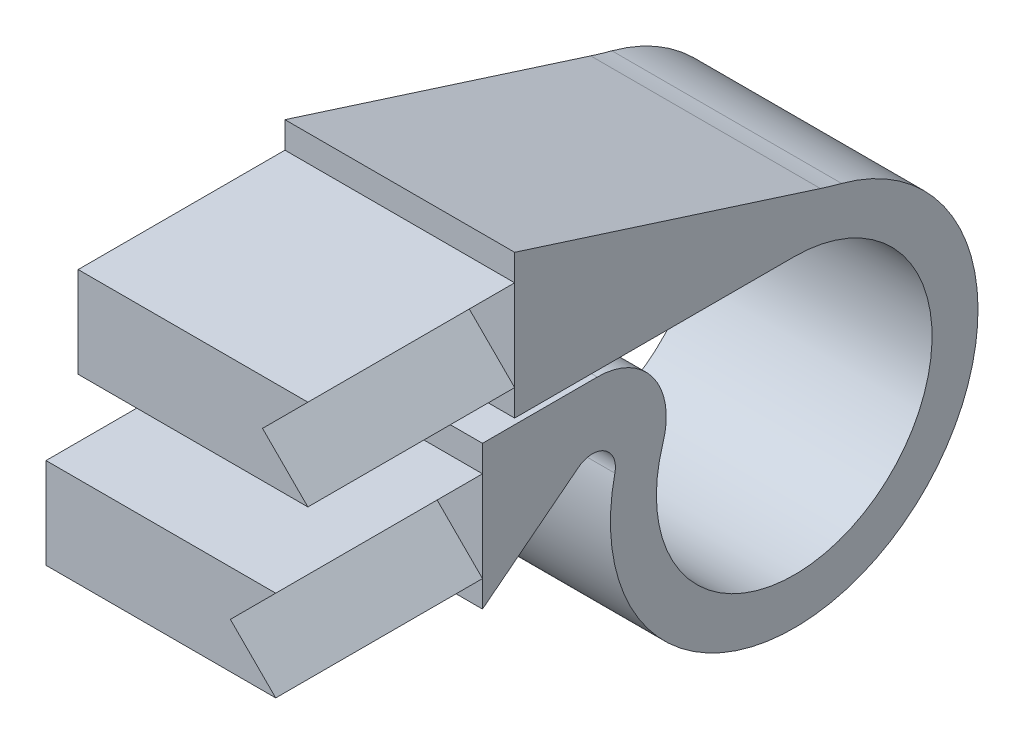
ISO-10303-21;
HEADER;
FILE_DESCRIPTION(('STEP AP214'),'2;1');
FILE_NAME('part.step','',(''),(''),'','','');
FILE_SCHEMA(('AUTOMOTIVE_DESIGN { 1 0 10303 214 1 1 1 1 }'));
ENDSEC;
DATA;
#1=APPLICATION_CONTEXT('core data for automotive mechanical design processes');
#2=APPLICATION_PROTOCOL_DEFINITION('international standard','automotive_design',2000,#1);
#3=PRODUCT_CONTEXT('',#1,'mechanical');
#4=PRODUCT('Part','Part','',(#3));
#5=PRODUCT_RELATED_PRODUCT_CATEGORY('part','',(#4));
#6=PRODUCT_DEFINITION_FORMATION('','',#4);
#7=PRODUCT_DEFINITION_CONTEXT('part definition',#1,'design');
#8=PRODUCT_DEFINITION('design','',#6,#7);
#9=PRODUCT_DEFINITION_SHAPE('','',#8);
#10=(LENGTH_UNIT() NAMED_UNIT(*) SI_UNIT(.MILLI.,.METRE.));
#11=(NAMED_UNIT(*) PLANE_ANGLE_UNIT() SI_UNIT($,.RADIAN.));
#12=(NAMED_UNIT(*) SI_UNIT($,.STERADIAN.) SOLID_ANGLE_UNIT());
#13=UNCERTAINTY_MEASURE_WITH_UNIT(LENGTH_MEASURE(1.E-05),#10,'distance_accuracy_value','');
#14=(GEOMETRIC_REPRESENTATION_CONTEXT(3) GLOBAL_UNCERTAINTY_ASSIGNED_CONTEXT((#13)) GLOBAL_UNIT_ASSIGNED_CONTEXT((#10,
#11,#12)) REPRESENTATION_CONTEXT('',''));
#15=CARTESIAN_POINT('',(0.,0.,0.));
#16=DIRECTION('',(0.,0.,1.));
#17=DIRECTION('',(1.,0.,0.));
#18=AXIS2_PLACEMENT_3D('',#15,#16,#17);
#19=CARTESIAN_POINT('',(10.,-6.5,13.5695682505013));
#20=DIRECTION('',(0.,0.,-1.));
#21=DIRECTION('',(-1.,0.,0.));
#22=AXIS2_PLACEMENT_3D('',#19,#20,#21);
#23=PLANE('',#22);
#24=DIRECTION('',(1.,0.,0.));
#25=VECTOR('',#24,1.);
#26=CARTESIAN_POINT('',(0.,-5.35000000000001,13.5695682505013));
#27=LINE('',#26,#25);
#28=CARTESIAN_POINT('',(0.,-5.35000000000001,13.5695682505013));
#29=VERTEX_POINT('',#28);
#30=CARTESIAN_POINT('',(10.,-5.35000000000001,13.5695682505013));
#31=VERTEX_POINT('',#30);
#32=EDGE_CURVE('E356',#29,#31,#27,.T.);
#33=ORIENTED_EDGE('',*,*,#32,.F.);
#34=DIRECTION('',(0.,-1.,0.));
#35=VECTOR('',#34,1.);
#36=CARTESIAN_POINT('',(0.,-6.5,13.5695682505013));
#37=LINE('',#36,#35);
#38=CARTESIAN_POINT('',(0.,-6.5,13.5695682505013));
#39=VERTEX_POINT('',#38);
#40=EDGE_CURVE('E200',#29,#39,#37,.T.);
#41=ORIENTED_EDGE('',*,*,#40,.T.);
#42=DIRECTION('',(-1.,0.,0.));
#43=VECTOR('',#42,1.);
#44=CARTESIAN_POINT('',(10.,-6.5,13.5695682505013));
#45=LINE('',#44,#43);
#46=CARTESIAN_POINT('',(10.,-6.5,13.5695682505013));
#47=VERTEX_POINT('',#46);
#48=EDGE_CURVE('E319',#47,#39,#45,.T.);
#49=ORIENTED_EDGE('',*,*,#48,.F.);
#50=DIRECTION('',(0.,-1.,0.));
#51=VECTOR('',#50,1.);
#52=CARTESIAN_POINT('',(10.,-6.5,13.5695682505013));
#53=LINE('',#52,#51);
#54=EDGE_CURVE('E254',#31,#47,#53,.T.);
#55=ORIENTED_EDGE('',*,*,#54,.F.);
#56=EDGE_LOOP('',(#33,#41,#49,#55));
#57=FACE_BOUND('',#56,.T.);
#58=ADVANCED_FACE('F33',(#57),#23,.F.);
#59=DIRECTION('',(-0.707106781186547,0.707106781186548,0.));
#60=VECTOR('',#59,1.);
#61=CARTESIAN_POINT('',(8.025,-3.375,13.5695682505013));
#62=LINE('',#61,#60);
#63=CARTESIAN_POINT('',(8.025,-3.375,13.5695682505013));
#64=VERTEX_POINT('',#63);
#65=EDGE_CURVE('E51',#31,#64,#62,.T.);
#66=ORIENTED_EDGE('',*,*,#65,.F.);
#67=CARTESIAN_POINT('',(10.,-1.4,13.5695682505013));
#68=VERTEX_POINT('',#67);
#69=EDGE_CURVE('E259',#68,#31,#53,.T.);
#70=ORIENTED_EDGE('',*,*,#69,.F.);
#71=DIRECTION('',(0.707106781186548,0.707106781186547,0.));
#72=VECTOR('',#71,1.);
#73=CARTESIAN_POINT('',(10.,-1.4,13.5695682505013));
#74=LINE('',#73,#72);
#75=EDGE_CURVE('E48',#64,#68,#74,.T.);
#76=ORIENTED_EDGE('',*,*,#75,.F.);
#77=EDGE_LOOP('',(#66,#70,#76));
#78=FACE_BOUND('',#77,.T.);
#79=ADVANCED_FACE('F367',(#78),#23,.F.);
#80=DIRECTION('',(-1.,0.,0.));
#81=VECTOR('',#80,1.);
#82=CARTESIAN_POINT('',(10.,-1.4,13.5695682505013));
#83=LINE('',#82,#81);
#84=CARTESIAN_POINT('',(0.,-1.4,13.5695682505013));
#85=VERTEX_POINT('',#84);
#86=EDGE_CURVE('E195',#68,#85,#83,.T.);
#87=ORIENTED_EDGE('',*,*,#86,.F.);
#88=CARTESIAN_POINT('',(10.,-0.25,13.5695682505013));
#89=VERTEX_POINT('',#88);
#90=EDGE_CURVE('E255',#89,#68,#53,.T.);
#91=ORIENTED_EDGE('',*,*,#90,.F.);
#92=DIRECTION('',(-1.,0.,0.));
#93=VECTOR('',#92,1.);
#94=CARTESIAN_POINT('',(10.,-0.25,13.5695682505013));
#95=LINE('',#94,#93);
#96=CARTESIAN_POINT('',(0.,-0.25,13.5695682505013));
#97=VERTEX_POINT('',#96);
#98=EDGE_CURVE('E322',#89,#97,#95,.T.);
#99=ORIENTED_EDGE('',*,*,#98,.T.);
#100=EDGE_CURVE('E283',#97,#85,#37,.T.);
#101=ORIENTED_EDGE('',*,*,#100,.T.);
#102=EDGE_LOOP('',(#87,#91,#99,#101));
#103=FACE_BOUND('',#102,.T.);
#104=ADVANCED_FACE('F336',(#103),#23,.F.);
#105=CARTESIAN_POINT('',(10.,6.25,12.1695682505013));
#106=DIRECTION('',(0.,0.,-1.));
#107=DIRECTION('',(-1.,0.,0.));
#108=AXIS2_PLACEMENT_3D('',#105,#106,#107);
#109=PLANE('',#108);
#110=DIRECTION('',(1.,0.,0.));
#111=VECTOR('',#110,1.);
#112=CARTESIAN_POINT('',(0.,1.14999999999999,12.1695682505013));
#113=LINE('',#112,#111);
#114=CARTESIAN_POINT('',(0.,1.14999999999999,12.1695682505013));
#115=VERTEX_POINT('',#114);
#116=CARTESIAN_POINT('',(10.,1.14999999999999,12.1695682505013));
#117=VERTEX_POINT('',#116);
#118=EDGE_CURVE('E202',#115,#117,#113,.T.);
#119=ORIENTED_EDGE('',*,*,#118,.F.);
#120=DIRECTION('',(0.,-1.,0.));
#121=VECTOR('',#120,1.);
#122=CARTESIAN_POINT('',(0.,6.25,12.1695682505013));
#123=LINE('',#122,#121);
#124=CARTESIAN_POINT('',(0.,0.,12.1695682505013));
#125=VERTEX_POINT('',#124);
#126=EDGE_CURVE('E295',#115,#125,#123,.T.);
#127=ORIENTED_EDGE('',*,*,#126,.T.);
#128=DIRECTION('',(-1.,0.,0.));
#129=VECTOR('',#128,1.);
#130=CARTESIAN_POINT('',(10.,0.,12.1695682505013));
#131=LINE('',#130,#129);
#132=CARTESIAN_POINT('',(10.,0.,12.1695682505013));
#133=VERTEX_POINT('',#132);
#134=EDGE_CURVE('E301',#133,#125,#131,.T.);
#135=ORIENTED_EDGE('',*,*,#134,.F.);
#136=DIRECTION('',(0.,-1.,0.));
#137=VECTOR('',#136,1.);
#138=CARTESIAN_POINT('',(10.,6.25,12.1695682505013));
#139=LINE('',#138,#137);
#140=EDGE_CURVE('E269',#117,#133,#139,.T.);
#141=ORIENTED_EDGE('',*,*,#140,.F.);
#142=EDGE_LOOP('',(#119,#127,#135,#141));
#143=FACE_BOUND('',#142,.T.);
#144=ADVANCED_FACE('F374',(#143),#109,.F.);
#145=DIRECTION('',(-0.707106781186547,0.707106781186548,0.));
#146=VECTOR('',#145,1.);
#147=CARTESIAN_POINT('',(8.025,3.125,12.1695682505013));
#148=LINE('',#147,#146);
#149=CARTESIAN_POINT('',(8.025,3.125,12.1695682505013));
#150=VERTEX_POINT('',#149);
#151=EDGE_CURVE('E205',#117,#150,#148,.T.);
#152=ORIENTED_EDGE('',*,*,#151,.F.);
#153=CARTESIAN_POINT('',(10.,5.1,12.1695682505013));
#154=VERTEX_POINT('',#153);
#155=EDGE_CURVE('E274',#154,#117,#139,.T.);
#156=ORIENTED_EDGE('',*,*,#155,.F.);
#157=DIRECTION('',(0.707106781186547,0.707106781186548,0.));
#158=VECTOR('',#157,1.);
#159=CARTESIAN_POINT('',(10.,5.1,12.1695682505013));
#160=LINE('',#159,#158);
#161=EDGE_CURVE('E226',#150,#154,#160,.T.);
#162=ORIENTED_EDGE('',*,*,#161,.F.);
#163=EDGE_LOOP('',(#152,#156,#162));
#164=FACE_BOUND('',#163,.T.);
#165=ADVANCED_FACE('F417',(#164),#109,.F.);
#166=DIRECTION('',(-1.,0.,0.));
#167=VECTOR('',#166,1.);
#168=CARTESIAN_POINT('',(10.,5.1,12.1695682505013));
#169=LINE('',#168,#167);
#170=CARTESIAN_POINT('',(0.,5.1,12.1695682505013));
#171=VERTEX_POINT('',#170);
#172=EDGE_CURVE('E215',#154,#171,#169,.T.);
#173=ORIENTED_EDGE('',*,*,#172,.F.);
#174=CARTESIAN_POINT('',(10.,6.25,12.1695682505013));
#175=VERTEX_POINT('',#174);
#176=EDGE_CURVE('E270',#175,#154,#139,.T.);
#177=ORIENTED_EDGE('',*,*,#176,.F.);
#178=DIRECTION('',(-1.,0.,0.));
#179=VECTOR('',#178,1.);
#180=CARTESIAN_POINT('',(10.,6.25,12.1695682505013));
#181=LINE('',#180,#179);
#182=CARTESIAN_POINT('',(0.,6.25,12.1695682505013));
#183=VERTEX_POINT('',#182);
#184=EDGE_CURVE('E304',#175,#183,#181,.T.);
#185=ORIENTED_EDGE('',*,*,#184,.T.);
#186=EDGE_CURVE('E296',#183,#171,#123,.T.);
#187=ORIENTED_EDGE('',*,*,#186,.T.);
#188=EDGE_LOOP('',(#173,#177,#185,#187));
#189=FACE_BOUND('',#188,.T.);
#190=ADVANCED_FACE('F385',(#189),#109,.F.);
#191=CARTESIAN_POINT('',(10.,-6.,0.));
#192=DIRECTION('',(-1.,0.,0.));
#193=DIRECTION('',(0.,0.,1.));
#194=AXIS2_PLACEMENT_3D('',#191,#192,#193);
#195=CYLINDRICAL_SURFACE('',#194,6.);
#196=CARTESIAN_POINT('',(0.,-6.,0.));
#197=DIRECTION('',(-1.,0.,0.));
#198=DIRECTION('',(0.,0.,1.));
#199=AXIS2_PLACEMENT_3D('',#196,#197,#198);
#200=CIRCLE('',#199,6.);
#201=CARTESIAN_POINT('',(0.,0.,0.));
#202=VERTEX_POINT('',#201);
#203=CARTESIAN_POINT('',(0.,-4.16666666666667,5.7130455003342));
#204=VERTEX_POINT('',#203);
#205=EDGE_CURVE('E245',#202,#204,#200,.T.);
#206=ORIENTED_EDGE('',*,*,#205,.T.);
#207=DIRECTION('',(-1.,0.,0.));
#208=VECTOR('',#207,1.);
#209=CARTESIAN_POINT('',(10.,-4.16666666666667,5.7130455003342));
#210=LINE('',#209,#208);
#211=CARTESIAN_POINT('',(10.,-4.16666666666667,5.7130455003342));
#212=VERTEX_POINT('',#211);
#213=EDGE_CURVE('E11',#212,#204,#210,.T.);
#214=ORIENTED_EDGE('',*,*,#213,.F.);
#215=CARTESIAN_POINT('',(10.,-6.,0.));
#216=DIRECTION('',(-1.,0.,0.));
#217=DIRECTION('',(0.,0.,1.));
#218=AXIS2_PLACEMENT_3D('',#215,#216,#217);
#219=CIRCLE('',#218,6.);
#220=CARTESIAN_POINT('',(10.,0.,0.));
#221=VERTEX_POINT('',#220);
#222=EDGE_CURVE('E246',#221,#212,#219,.T.);
#223=ORIENTED_EDGE('',*,*,#222,.F.);
#224=DIRECTION('',(-1.,0.,0.));
#225=VECTOR('',#224,1.);
#226=CARTESIAN_POINT('',(10.,0.,0.));
#227=LINE('',#226,#225);
#228=EDGE_CURVE('E276',#221,#202,#227,.T.);
#229=ORIENTED_EDGE('',*,*,#228,.T.);
#230=EDGE_LOOP('',(#206,#214,#223,#229));
#231=FACE_BOUND('',#230,.T.);
#232=ADVANCED_FACE('F35',(#231),#195,.F.);
#233=CARTESIAN_POINT('',(10.,-3.25,8.56956825050131));
#234=DIRECTION('',(-1.,0.,0.));
#235=DIRECTION('',(0.,0.,1.));
#236=AXIS2_PLACEMENT_3D('',#233,#234,#235);
#237=CYLINDRICAL_SURFACE('',#236,3.);
#238=CARTESIAN_POINT('',(0.,-3.25,8.56956825050131));
#239=DIRECTION('',(1.,0.,0.));
#240=DIRECTION('',(0.,0.,-1.));
#241=AXIS2_PLACEMENT_3D('',#238,#239,#240);
#242=CIRCLE('',#241,3.);
#243=CARTESIAN_POINT('',(0.,-0.25,8.56956825050131));
#244=VERTEX_POINT('',#243);
#245=EDGE_CURVE('E279',#204,#244,#242,.T.);
#246=ORIENTED_EDGE('',*,*,#245,.T.);
#247=DIRECTION('',(-1.,0.,0.));
#248=VECTOR('',#247,1.);
#249=CARTESIAN_POINT('',(10.,-0.25,8.56956825050131));
#250=LINE('',#249,#248);
#251=CARTESIAN_POINT('',(10.,-0.25,8.56956825050131));
#252=VERTEX_POINT('',#251);
#253=EDGE_CURVE('E41',#252,#244,#250,.T.);
#254=ORIENTED_EDGE('',*,*,#253,.F.);
#255=CARTESIAN_POINT('',(10.,-3.25,8.56956825050131));
#256=DIRECTION('',(1.,0.,0.));
#257=DIRECTION('',(0.,0.,-1.));
#258=AXIS2_PLACEMENT_3D('',#255,#256,#257);
#259=CIRCLE('',#258,3.);
#260=EDGE_CURVE('E249',#212,#252,#259,.T.);
#261=ORIENTED_EDGE('',*,*,#260,.F.);
#262=ORIENTED_EDGE('',*,*,#213,.T.);
#263=EDGE_LOOP('',(#246,#254,#261,#262));
#264=FACE_BOUND('',#263,.T.);
#265=ADVANCED_FACE('F380',(#264),#237,.T.);
#266=CARTESIAN_POINT('',(10.,-0.25,8.56956825050131));
#267=DIRECTION('',(0.,-1.,0.));
#268=DIRECTION('',(0.,0.,-1.));
#269=AXIS2_PLACEMENT_3D('',#266,#267,#268);
#270=PLANE('',#269);
#271=DIRECTION('',(0.,0.,1.));
#272=VECTOR('',#271,1.);
#273=CARTESIAN_POINT('',(0.,-0.25,8.56956825050131));
#274=LINE('',#273,#272);
#275=EDGE_CURVE('E281',#244,#97,#274,.T.);
#276=ORIENTED_EDGE('',*,*,#275,.T.);
#277=ORIENTED_EDGE('',*,*,#98,.F.);
#278=DIRECTION('',(0.,0.,1.));
#279=VECTOR('',#278,1.);
#280=CARTESIAN_POINT('',(10.,-0.25,8.56956825050131));
#281=LINE('',#280,#279);
#282=EDGE_CURVE('E252',#252,#89,#281,.T.);
#283=ORIENTED_EDGE('',*,*,#282,.F.);
#284=ORIENTED_EDGE('',*,*,#253,.T.);
#285=EDGE_LOOP('',(#276,#277,#283,#284));
#286=FACE_BOUND('',#285,.T.);
#287=ADVANCED_FACE('F329',(#286),#270,.F.);
#288=CARTESIAN_POINT('',(10.,-6.5,13.5695682505013));
#289=DIRECTION('',(0.,0.788828711999176,0.614613100353158));
#290=DIRECTION('',(0.,-0.614613100353158,0.788828711999176));
#291=AXIS2_PLACEMENT_3D('',#288,#289,#290);
#292=PLANE('',#291);
#293=DIRECTION('',(0.,0.614613100353158,-0.788828711999176));
#294=VECTOR('',#293,1.);
#295=CARTESIAN_POINT('',(0.,-6.5,13.5695682505013));
#296=LINE('',#295,#294);
#297=CARTESIAN_POINT('',(0.,-3.25,9.39833709300691));
#298=VERTEX_POINT('',#297);
#299=EDGE_CURVE('E285',#39,#298,#296,.T.);
#300=ORIENTED_EDGE('',*,*,#299,.T.);
#301=DIRECTION('',(-1.,0.,0.));
#302=VECTOR('',#301,1.);
#303=CARTESIAN_POINT('',(10.,-3.25,9.39833709300691));
#304=LINE('',#303,#302);
#305=CARTESIAN_POINT('',(10.,-3.25,9.39833709300691));
#306=VERTEX_POINT('',#305);
#307=EDGE_CURVE('E316',#306,#298,#304,.T.);
#308=ORIENTED_EDGE('',*,*,#307,.F.);
#309=DIRECTION('',(0.,0.614613100353158,-0.788828711999176));
#310=VECTOR('',#309,1.);
#311=CARTESIAN_POINT('',(10.,-6.5,13.5695682505013));
#312=LINE('',#311,#310);
#313=EDGE_CURVE('E258',#47,#306,#312,.T.);
#314=ORIENTED_EDGE('',*,*,#313,.F.);
#315=ORIENTED_EDGE('',*,*,#48,.T.);
#316=EDGE_LOOP('',(#300,#308,#314,#315));
#317=FACE_BOUND('',#316,.T.);
#318=ADVANCED_FACE('F377',(#317),#292,.F.);
#319=CARTESIAN_POINT('',(10.,-4.03882871199918,8.78372399265375));
#320=DIRECTION('',(-1.,0.,0.));
#321=DIRECTION('',(0.,0.,1.));
#322=AXIS2_PLACEMENT_3D('',#319,#320,#321);
#323=CYLINDRICAL_SURFACE('',#322,1.);
#324=CARTESIAN_POINT('',(0.,-4.03882871199918,8.78372399265375));
#325=DIRECTION('',(-1.,0.,0.));
#326=DIRECTION('',(0.,0.,-1.));
#327=AXIS2_PLACEMENT_3D('',#324,#325,#326);
#328=CIRCLE('',#327,1.);
#329=CARTESIAN_POINT('',(0.,-4.25673663288816,7.80775466013667));
#330=VERTEX_POINT('',#329);
#331=EDGE_CURVE('E287',#298,#330,#328,.T.);
#332=ORIENTED_EDGE('',*,*,#331,.T.);
#333=DIRECTION('',(-1.,0.,0.));
#334=VECTOR('',#333,1.);
#335=CARTESIAN_POINT('',(10.,-4.25673663288816,7.80775466013667));
#336=LINE('',#335,#334);
#337=CARTESIAN_POINT('',(10.,-4.25673663288816,7.80775466013667));
#338=VERTEX_POINT('',#337);
#339=EDGE_CURVE('E313',#338,#330,#336,.T.);
#340=ORIENTED_EDGE('',*,*,#339,.F.);
#341=CARTESIAN_POINT('',(10.,-4.03882871199918,8.78372399265375));
#342=DIRECTION('',(-1.,0.,0.));
#343=DIRECTION('',(0.,0.,-1.));
#344=AXIS2_PLACEMENT_3D('',#341,#342,#343);
#345=CIRCLE('',#344,1.);
#346=EDGE_CURVE('E261',#306,#338,#345,.T.);
#347=ORIENTED_EDGE('',*,*,#346,.F.);
#348=ORIENTED_EDGE('',*,*,#307,.T.);
#349=EDGE_LOOP('',(#332,#340,#347,#348));
#350=FACE_BOUND('',#349,.T.);
#351=ADVANCED_FACE('F454',(#350),#323,.F.);
#352=CARTESIAN_POINT('',(10.,-6.,0.));
#353=DIRECTION('',(-1.,0.,0.));
#354=DIRECTION('',(0.,0.,1.));
#355=AXIS2_PLACEMENT_3D('',#352,#353,#354);
#356=CYLINDRICAL_SURFACE('',#355,8.);
#357=CARTESIAN_POINT('',(0.,-6.,0.));
#358=DIRECTION('',(1.,0.,0.));
#359=DIRECTION('',(0.,0.,1.));
#360=AXIS2_PLACEMENT_3D('',#357,#358,#359);
#361=CIRCLE('',#360,8.);
#362=CARTESIAN_POINT('',(0.,1.72919712561127,-2.06385847224136));
#363=VERTEX_POINT('',#362);
#364=EDGE_CURVE('E289',#330,#363,#361,.T.);
#365=ORIENTED_EDGE('',*,*,#364,.T.);
#366=DIRECTION('',(-1.,0.,0.));
#367=VECTOR('',#366,1.);
#368=CARTESIAN_POINT('',(10.,1.72919712561127,-2.06385847224136));
#369=LINE('',#368,#367);
#370=CARTESIAN_POINT('',(10.,1.72919712561127,-2.06385847224136));
#371=VERTEX_POINT('',#370);
#372=EDGE_CURVE('E310',#371,#363,#369,.T.);
#373=ORIENTED_EDGE('',*,*,#372,.F.);
#374=CARTESIAN_POINT('',(10.,-6.,0.));
#375=DIRECTION('',(1.,0.,0.));
#376=DIRECTION('',(0.,0.,1.));
#377=AXIS2_PLACEMENT_3D('',#374,#375,#376);
#378=CIRCLE('',#377,8.);
#379=EDGE_CURVE('E263',#338,#371,#378,.T.);
#380=ORIENTED_EDGE('',*,*,#379,.F.);
#381=ORIENTED_EDGE('',*,*,#339,.T.);
#382=EDGE_LOOP('',(#365,#373,#380,#381));
#383=FACE_BOUND('',#382,.T.);
#384=ADVANCED_FACE('F451',(#383),#356,.T.);
#385=CARTESIAN_POINT('',(10.,21.0521899396394,-7.22350465284478));
#386=DIRECTION('',(-1.,0.,0.));
#387=DIRECTION('',(0.,0.,1.));
#388=AXIS2_PLACEMENT_3D('',#385,#386,#387);
#389=CYLINDRICAL_SURFACE('',#388,20.);
#390=CARTESIAN_POINT('',(0.,21.0521899396394,-7.22350465284478));
#391=DIRECTION('',(-1.,0.,0.));
#392=DIRECTION('',(0.,0.,1.));
#393=AXIS2_PLACEMENT_3D('',#390,#391,#392);
#394=CIRCLE('',#393,20.);
#395=CARTESIAN_POINT('',(0.,2.,-1.139586630394));
#396=VERTEX_POINT('',#395);
#397=EDGE_CURVE('E291',#363,#396,#394,.T.);
#398=ORIENTED_EDGE('',*,*,#397,.T.);
#399=DIRECTION('',(-1.,0.,0.));
#400=VECTOR('',#399,1.);
#401=CARTESIAN_POINT('',(10.,2.,-1.139586630394));
#402=LINE('',#401,#400);
#403=CARTESIAN_POINT('',(10.,2.,-1.139586630394));
#404=VERTEX_POINT('',#403);
#405=EDGE_CURVE('E307',#404,#396,#402,.T.);
#406=ORIENTED_EDGE('',*,*,#405,.F.);
#407=CARTESIAN_POINT('',(10.,21.0521899396394,-7.22350465284478));
#408=DIRECTION('',(-1.,0.,0.));
#409=DIRECTION('',(0.,0.,1.));
#410=AXIS2_PLACEMENT_3D('',#407,#408,#409);
#411=CIRCLE('',#410,20.);
#412=EDGE_CURVE('E265',#371,#404,#411,.T.);
#413=ORIENTED_EDGE('',*,*,#412,.F.);
#414=ORIENTED_EDGE('',*,*,#372,.T.);
#415=EDGE_LOOP('',(#398,#406,#413,#414));
#416=FACE_BOUND('',#415,.T.);
#417=ADVANCED_FACE('F447',(#416),#389,.F.);
#418=CARTESIAN_POINT('',(10.,2.,-1.139586630394));
#419=DIRECTION('',(0.,-0.952609496981973,0.304195901122539));
#420=DIRECTION('',(0.,-0.304195901122539,-0.952609496981973));
#421=AXIS2_PLACEMENT_3D('',#418,#419,#420);
#422=PLANE('',#421);
#423=DIRECTION('',(0.,0.304195901122539,0.952609496981973));
#424=VECTOR('',#423,1.);
#425=CARTESIAN_POINT('',(0.,2.,-1.139586630394));
#426=LINE('',#425,#424);
#427=EDGE_CURVE('E293',#396,#183,#426,.T.);
#428=ORIENTED_EDGE('',*,*,#427,.T.);
#429=ORIENTED_EDGE('',*,*,#184,.F.);
#430=DIRECTION('',(0.,0.304195901122539,0.952609496981973));
#431=VECTOR('',#430,1.);
#432=CARTESIAN_POINT('',(10.,2.,-1.139586630394));
#433=LINE('',#432,#431);
#434=EDGE_CURVE('E267',#404,#175,#433,.T.);
#435=ORIENTED_EDGE('',*,*,#434,.F.);
#436=ORIENTED_EDGE('',*,*,#405,.T.);
#437=EDGE_LOOP('',(#428,#429,#435,#436));
#438=FACE_BOUND('',#437,.T.);
#439=ADVANCED_FACE('F442',(#438),#422,.F.);
#440=CARTESIAN_POINT('',(10.,0.,0.));
#441=DIRECTION('',(0.,1.,0.));
#442=DIRECTION('',(0.,0.,1.));
#443=AXIS2_PLACEMENT_3D('',#440,#441,#442);
#444=PLANE('',#443);
#445=DIRECTION('',(0.,0.,-1.));
#446=VECTOR('',#445,1.);
#447=CARTESIAN_POINT('',(0.,0.,0.));
#448=LINE('',#447,#446);
#449=EDGE_CURVE('E250',#125,#202,#448,.T.);
#450=ORIENTED_EDGE('',*,*,#449,.T.);
#451=ORIENTED_EDGE('',*,*,#228,.F.);
#452=DIRECTION('',(0.,0.,-1.));
#453=VECTOR('',#452,1.);
#454=CARTESIAN_POINT('',(10.,0.,0.));
#455=LINE('',#454,#453);
#456=EDGE_CURVE('E273',#133,#221,#455,.T.);
#457=ORIENTED_EDGE('',*,*,#456,.F.);
#458=ORIENTED_EDGE('',*,*,#134,.T.);
#459=EDGE_LOOP('',(#450,#451,#457,#458));
#460=FACE_BOUND('',#459,.T.);
#461=ADVANCED_FACE('F394',(#460),#444,.F.);
#462=CARTESIAN_POINT('',(10.,-6.,0.));
#463=DIRECTION('',(-1.,0.,0.));
#464=DIRECTION('',(0.,0.,1.));
#465=AXIS2_PLACEMENT_3D('',#462,#463,#464);
#466=PLANE('',#465);
#467=ORIENTED_EDGE('',*,*,#222,.T.);
#468=ORIENTED_EDGE('',*,*,#260,.T.);
#469=ORIENTED_EDGE('',*,*,#282,.T.);
#470=ORIENTED_EDGE('',*,*,#90,.T.);
#471=ORIENTED_EDGE('',*,*,#69,.T.);
#472=ORIENTED_EDGE('',*,*,#54,.T.);
#473=ORIENTED_EDGE('',*,*,#313,.T.);
#474=ORIENTED_EDGE('',*,*,#346,.T.);
#475=ORIENTED_EDGE('',*,*,#379,.T.);
#476=ORIENTED_EDGE('',*,*,#412,.T.);
#477=ORIENTED_EDGE('',*,*,#434,.T.);
#478=ORIENTED_EDGE('',*,*,#176,.T.);
#479=ORIENTED_EDGE('',*,*,#155,.T.);
#480=ORIENTED_EDGE('',*,*,#140,.T.);
#481=ORIENTED_EDGE('',*,*,#456,.T.);
#482=EDGE_LOOP('',(#467,#468,#469,#470,#471,#472,#473,#474,#475,#476,#477,#478,#479,#480,#481));
#483=FACE_BOUND('',#482,.T.);
#484=ADVANCED_FACE('F366',(#483),#466,.F.);
#485=CARTESIAN_POINT('',(0.,-6.,0.));
#486=DIRECTION('',(-1.,0.,0.));
#487=DIRECTION('',(0.,0.,1.));
#488=AXIS2_PLACEMENT_3D('',#485,#486,#487);
#489=PLANE('',#488);
#490=ORIENTED_EDGE('',*,*,#205,.F.);
#491=ORIENTED_EDGE('',*,*,#449,.F.);
#492=ORIENTED_EDGE('',*,*,#126,.F.);
#493=DIRECTION('',(0.,0.,-1.));
#494=VECTOR('',#493,1.);
#495=CARTESIAN_POINT('',(0.,1.14999999999999,21.1695682505013));
#496=LINE('',#495,#494);
#497=CARTESIAN_POINT('',(0.,1.14999999999999,21.1695682505013));
#498=VERTEX_POINT('',#497);
#499=EDGE_CURVE('E242',#498,#115,#496,.T.);
#500=ORIENTED_EDGE('',*,*,#499,.F.);
#501=DIRECTION('',(0.,-1.,0.));
#502=VECTOR('',#501,1.);
#503=CARTESIAN_POINT('',(0.,5.1,21.1695682505013));
#504=LINE('',#503,#502);
#505=CARTESIAN_POINT('',(0.,5.1,21.1695682505013));
#506=VERTEX_POINT('',#505);
#507=EDGE_CURVE('E211',#506,#498,#504,.T.);
#508=ORIENTED_EDGE('',*,*,#507,.F.);
#509=DIRECTION('',(0.,0.,-1.));
#510=VECTOR('',#509,1.);
#511=CARTESIAN_POINT('',(0.,5.1,21.1695682505013));
#512=LINE('',#511,#510);
#513=EDGE_CURVE('E222',#506,#171,#512,.T.);
#514=ORIENTED_EDGE('',*,*,#513,.T.);
#515=ORIENTED_EDGE('',*,*,#186,.F.);
#516=ORIENTED_EDGE('',*,*,#427,.F.);
#517=ORIENTED_EDGE('',*,*,#397,.F.);
#518=ORIENTED_EDGE('',*,*,#364,.F.);
#519=ORIENTED_EDGE('',*,*,#331,.F.);
#520=ORIENTED_EDGE('',*,*,#299,.F.);
#521=ORIENTED_EDGE('',*,*,#40,.F.);
#522=DIRECTION('',(0.,0.,-1.));
#523=VECTOR('',#522,1.);
#524=CARTESIAN_POINT('',(0.,-5.35000000000001,22.5695682505013));
#525=LINE('',#524,#523);
#526=CARTESIAN_POINT('',(0.,-5.35000000000001,22.5695682505013));
#527=VERTEX_POINT('',#526);
#528=EDGE_CURVE('E180',#527,#29,#525,.T.);
#529=ORIENTED_EDGE('',*,*,#528,.F.);
#530=DIRECTION('',(0.,-1.,0.));
#531=VECTOR('',#530,1.);
#532=CARTESIAN_POINT('',(0.,-1.4,22.5695682505013));
#533=LINE('',#532,#531);
#534=CARTESIAN_POINT('',(0.,-1.4,22.5695682505013));
#535=VERTEX_POINT('',#534);
#536=EDGE_CURVE('E186',#535,#527,#533,.T.);
#537=ORIENTED_EDGE('',*,*,#536,.F.);
#538=DIRECTION('',(0.,0.,-1.));
#539=VECTOR('',#538,1.);
#540=CARTESIAN_POINT('',(0.,-1.4,22.5695682505013));
#541=LINE('',#540,#539);
#542=EDGE_CURVE('E333',#535,#85,#541,.T.);
#543=ORIENTED_EDGE('',*,*,#542,.T.);
#544=ORIENTED_EDGE('',*,*,#100,.F.);
#545=ORIENTED_EDGE('',*,*,#275,.F.);
#546=ORIENTED_EDGE('',*,*,#245,.F.);
#547=EDGE_LOOP('',(#490,#491,#492,#500,#508,#514,#515,#516,#517,#518,#519,#520,#521,#529,#537,
#543,#544,#545,#546));
#548=FACE_BOUND('',#547,.T.);
#549=ADVANCED_FACE('F198',(#548),#489,.T.);
#550=CARTESIAN_POINT('',(0.,1.14999999999999,21.1695682505013));
#551=DIRECTION('',(0.,1.,0.));
#552=DIRECTION('',(-1.,0.,0.));
#553=AXIS2_PLACEMENT_3D('',#550,#551,#552);
#554=PLANE('',#553);
#555=ORIENTED_EDGE('',*,*,#118,.T.);
#556=DIRECTION('',(0.,0.,-1.));
#557=VECTOR('',#556,1.);
#558=CARTESIAN_POINT('',(10.,1.14999999999999,21.1695682505013));
#559=LINE('',#558,#557);
#560=CARTESIAN_POINT('',(10.,1.14999999999999,21.1695682505013));
#561=VERTEX_POINT('',#560);
#562=EDGE_CURVE('E239',#561,#117,#559,.T.);
#563=ORIENTED_EDGE('',*,*,#562,.F.);
#564=DIRECTION('',(1.,0.,0.));
#565=VECTOR('',#564,1.);
#566=CARTESIAN_POINT('',(0.,1.14999999999999,21.1695682505013));
#567=LINE('',#566,#565);
#568=EDGE_CURVE('E214',#498,#561,#567,.T.);
#569=ORIENTED_EDGE('',*,*,#568,.F.);
#570=ORIENTED_EDGE('',*,*,#499,.T.);
#571=EDGE_LOOP('',(#555,#563,#569,#570));
#572=FACE_BOUND('',#571,.T.);
#573=ADVANCED_FACE('F402',(#572),#554,.F.);
#574=CARTESIAN_POINT('',(8.025,3.125,21.1695682505013));
#575=DIRECTION('',(-0.707106781186548,-0.707106781186547,0.));
#576=DIRECTION('',(0.707106781186547,-0.707106781186548,0.));
#577=AXIS2_PLACEMENT_3D('',#574,#575,#576);
#578=PLANE('',#577);
#579=ORIENTED_EDGE('',*,*,#151,.T.);
#580=DIRECTION('',(0.,0.,-1.));
#581=VECTOR('',#580,1.);
#582=CARTESIAN_POINT('',(8.025,3.125,21.1695682505013));
#583=LINE('',#582,#581);
#584=CARTESIAN_POINT('',(8.025,3.125,21.1695682505013));
#585=VERTEX_POINT('',#584);
#586=EDGE_CURVE('E236',#585,#150,#583,.T.);
#587=ORIENTED_EDGE('',*,*,#586,.F.);
#588=DIRECTION('',(-0.707106781186547,0.707106781186548,0.));
#589=VECTOR('',#588,1.);
#590=CARTESIAN_POINT('',(8.025,3.125,21.1695682505013));
#591=LINE('',#590,#589);
#592=EDGE_CURVE('E217',#561,#585,#591,.T.);
#593=ORIENTED_EDGE('',*,*,#592,.F.);
#594=ORIENTED_EDGE('',*,*,#562,.T.);
#595=EDGE_LOOP('',(#579,#587,#593,#594));
#596=FACE_BOUND('',#595,.T.);
#597=ADVANCED_FACE('F425',(#596),#578,.F.);
#598=CARTESIAN_POINT('',(10.,5.1,21.1695682505013));
#599=DIRECTION('',(-0.707106781186548,0.707106781186547,0.));
#600=DIRECTION('',(-0.707106781186547,-0.707106781186548,0.));
#601=AXIS2_PLACEMENT_3D('',#598,#599,#600);
#602=PLANE('',#601);
#603=ORIENTED_EDGE('',*,*,#161,.T.);
#604=DIRECTION('',(0.,0.,-1.));
#605=VECTOR('',#604,1.);
#606=CARTESIAN_POINT('',(10.,5.1,21.1695682505013));
#607=LINE('',#606,#605);
#608=CARTESIAN_POINT('',(10.,5.1,21.1695682505013));
#609=VERTEX_POINT('',#608);
#610=EDGE_CURVE('E233',#609,#154,#607,.T.);
#611=ORIENTED_EDGE('',*,*,#610,.F.);
#612=DIRECTION('',(0.707106781186547,0.707106781186548,0.));
#613=VECTOR('',#612,1.);
#614=CARTESIAN_POINT('',(10.,5.1,21.1695682505013));
#615=LINE('',#614,#613);
#616=EDGE_CURVE('E219',#585,#609,#615,.T.);
#617=ORIENTED_EDGE('',*,*,#616,.F.);
#618=ORIENTED_EDGE('',*,*,#586,.T.);
#619=EDGE_LOOP('',(#603,#611,#617,#618));
#620=FACE_BOUND('',#619,.T.);
#621=ADVANCED_FACE('F421',(#620),#602,.F.);
#622=CARTESIAN_POINT('',(10.,5.1,21.1695682505013));
#623=DIRECTION('',(0.,-1.,0.));
#624=DIRECTION('',(1.,0.,0.));
#625=AXIS2_PLACEMENT_3D('',#622,#623,#624);
#626=PLANE('',#625);
#627=ORIENTED_EDGE('',*,*,#172,.T.);
#628=ORIENTED_EDGE('',*,*,#513,.F.);
#629=DIRECTION('',(-1.,0.,0.));
#630=VECTOR('',#629,1.);
#631=CARTESIAN_POINT('',(10.,5.1,21.1695682505013));
#632=LINE('',#631,#630);
#633=EDGE_CURVE('E221',#609,#506,#632,.T.);
#634=ORIENTED_EDGE('',*,*,#633,.F.);
#635=ORIENTED_EDGE('',*,*,#610,.T.);
#636=EDGE_LOOP('',(#627,#628,#634,#635));
#637=FACE_BOUND('',#636,.T.);
#638=ADVANCED_FACE('F412',(#637),#626,.F.);
#639=CARTESIAN_POINT('',(0.,0.,21.1695682505013));
#640=DIRECTION('',(0.,0.,1.));
#641=DIRECTION('',(1.,0.,0.));
#642=AXIS2_PLACEMENT_3D('',#639,#640,#641);
#643=PLANE('',#642);
#644=ORIENTED_EDGE('',*,*,#507,.T.);
#645=ORIENTED_EDGE('',*,*,#568,.T.);
#646=ORIENTED_EDGE('',*,*,#592,.T.);
#647=ORIENTED_EDGE('',*,*,#616,.T.);
#648=ORIENTED_EDGE('',*,*,#633,.T.);
#649=EDGE_LOOP('',(#644,#645,#646,#647,#648));
#650=FACE_BOUND('',#649,.T.);
#651=ADVANCED_FACE('F407',(#650),#643,.T.);
#652=CARTESIAN_POINT('',(0.,-5.35000000000001,22.5695682505013));
#653=DIRECTION('',(0.,1.,0.));
#654=DIRECTION('',(-1.,0.,0.));
#655=AXIS2_PLACEMENT_3D('',#652,#653,#654);
#656=PLANE('',#655);
#657=ORIENTED_EDGE('',*,*,#32,.T.);
#658=DIRECTION('',(0.,0.,-1.));
#659=VECTOR('',#658,1.);
#660=CARTESIAN_POINT('',(10.,-5.35000000000001,22.5695682505013));
#661=LINE('',#660,#659);
#662=CARTESIAN_POINT('',(10.,-5.35000000000001,22.5695682505013));
#663=VERTEX_POINT('',#662);
#664=EDGE_CURVE('E182',#663,#31,#661,.T.);
#665=ORIENTED_EDGE('',*,*,#664,.F.);
#666=DIRECTION('',(1.,0.,0.));
#667=VECTOR('',#666,1.);
#668=CARTESIAN_POINT('',(0.,-5.35000000000001,22.5695682505013));
#669=LINE('',#668,#667);
#670=EDGE_CURVE('E175',#527,#663,#669,.T.);
#671=ORIENTED_EDGE('',*,*,#670,.F.);
#672=ORIENTED_EDGE('',*,*,#528,.T.);
#673=EDGE_LOOP('',(#657,#665,#671,#672));
#674=FACE_BOUND('',#673,.T.);
#675=ADVANCED_FACE('F178',(#674),#656,.F.);
#676=CARTESIAN_POINT('',(8.025,-3.375,22.5695682505013));
#677=DIRECTION('',(-0.707106781186548,-0.707106781186547,0.));
#678=DIRECTION('',(0.707106781186547,-0.707106781186548,0.));
#679=AXIS2_PLACEMENT_3D('',#676,#677,#678);
#680=PLANE('',#679);
#681=ORIENTED_EDGE('',*,*,#65,.T.);
#682=DIRECTION('',(0.,0.,-1.));
#683=VECTOR('',#682,1.);
#684=CARTESIAN_POINT('',(8.025,-3.375,22.5695682505013));
#685=LINE('',#684,#683);
#686=CARTESIAN_POINT('',(8.025,-3.375,22.5695682505013));
#687=VERTEX_POINT('',#686);
#688=EDGE_CURVE('E207',#687,#64,#685,.T.);
#689=ORIENTED_EDGE('',*,*,#688,.F.);
#690=DIRECTION('',(-0.707106781186547,0.707106781186548,0.));
#691=VECTOR('',#690,1.);
#692=CARTESIAN_POINT('',(8.025,-3.375,22.5695682505013));
#693=LINE('',#692,#691);
#694=EDGE_CURVE('E185',#663,#687,#693,.T.);
#695=ORIENTED_EDGE('',*,*,#694,.F.);
#696=ORIENTED_EDGE('',*,*,#664,.T.);
#697=EDGE_LOOP('',(#681,#689,#695,#696));
#698=FACE_BOUND('',#697,.T.);
#699=ADVANCED_FACE('F355',(#698),#680,.F.);
#700=CARTESIAN_POINT('',(10.,-1.4,22.5695682505013));
#701=DIRECTION('',(-0.707106781186547,0.707106781186548,0.));
#702=DIRECTION('',(-0.707106781186548,-0.707106781186547,0.));
#703=AXIS2_PLACEMENT_3D('',#700,#701,#702);
#704=PLANE('',#703);
#705=ORIENTED_EDGE('',*,*,#75,.T.);
#706=DIRECTION('',(0.,0.,-1.));
#707=VECTOR('',#706,1.);
#708=CARTESIAN_POINT('',(10.,-1.4,22.5695682505013));
#709=LINE('',#708,#707);
#710=CARTESIAN_POINT('',(10.,-1.4,22.5695682505013));
#711=VERTEX_POINT('',#710);
#712=EDGE_CURVE('E342',#711,#68,#709,.T.);
#713=ORIENTED_EDGE('',*,*,#712,.F.);
#714=DIRECTION('',(0.707106781186548,0.707106781186547,0.));
#715=VECTOR('',#714,1.);
#716=CARTESIAN_POINT('',(10.,-1.4,22.5695682505013));
#717=LINE('',#716,#715);
#718=EDGE_CURVE('E353',#687,#711,#717,.T.);
#719=ORIENTED_EDGE('',*,*,#718,.F.);
#720=ORIENTED_EDGE('',*,*,#688,.T.);
#721=EDGE_LOOP('',(#705,#713,#719,#720));
#722=FACE_BOUND('',#721,.T.);
#723=ADVANCED_FACE('F352',(#722),#704,.F.);
#724=CARTESIAN_POINT('',(10.,-1.4,22.5695682505013));
#725=DIRECTION('',(0.,-1.,0.));
#726=DIRECTION('',(1.,0.,0.));
#727=AXIS2_PLACEMENT_3D('',#724,#725,#726);
#728=PLANE('',#727);
#729=ORIENTED_EDGE('',*,*,#86,.T.);
#730=ORIENTED_EDGE('',*,*,#542,.F.);
#731=DIRECTION('',(-1.,0.,0.));
#732=VECTOR('',#731,1.);
#733=CARTESIAN_POINT('',(10.,-1.4,22.5695682505013));
#734=LINE('',#733,#732);
#735=EDGE_CURVE('E191',#711,#535,#734,.T.);
#736=ORIENTED_EDGE('',*,*,#735,.F.);
#737=ORIENTED_EDGE('',*,*,#712,.T.);
#738=EDGE_LOOP('',(#729,#730,#736,#737));
#739=FACE_BOUND('',#738,.T.);
#740=ADVANCED_FACE('F340',(#739),#728,.F.);
#741=CARTESIAN_POINT('',(0.,0.,22.5695682505013));
#742=DIRECTION('',(0.,0.,1.));
#743=DIRECTION('',(1.,0.,0.));
#744=AXIS2_PLACEMENT_3D('',#741,#742,#743);
#745=PLANE('',#744);
#746=ORIENTED_EDGE('',*,*,#536,.T.);
#747=ORIENTED_EDGE('',*,*,#670,.T.);
#748=ORIENTED_EDGE('',*,*,#694,.T.);
#749=ORIENTED_EDGE('',*,*,#718,.T.);
#750=ORIENTED_EDGE('',*,*,#735,.T.);
#751=EDGE_LOOP('',(#746,#747,#748,#749,#750));
#752=FACE_BOUND('',#751,.T.);
#753=ADVANCED_FACE('F189',(#752),#745,.T.);
#754=CLOSED_SHELL('',(#58,#79,#104,#144,#165,#190,#232,#265,#287,#318,#351,#384,#417,#439,#461,
#484,#549,#573,#597,#621,#638,#651,#675,#699,#723,#740,#753));
#755=MANIFOLD_SOLID_BREP('B2',#754);
#756=ADVANCED_BREP_SHAPE_REPRESENTATION('',(#18,#755),#14);
#757=SHAPE_DEFINITION_REPRESENTATION(#9,#756);
ENDSEC;
END-ISO-10303-21;
